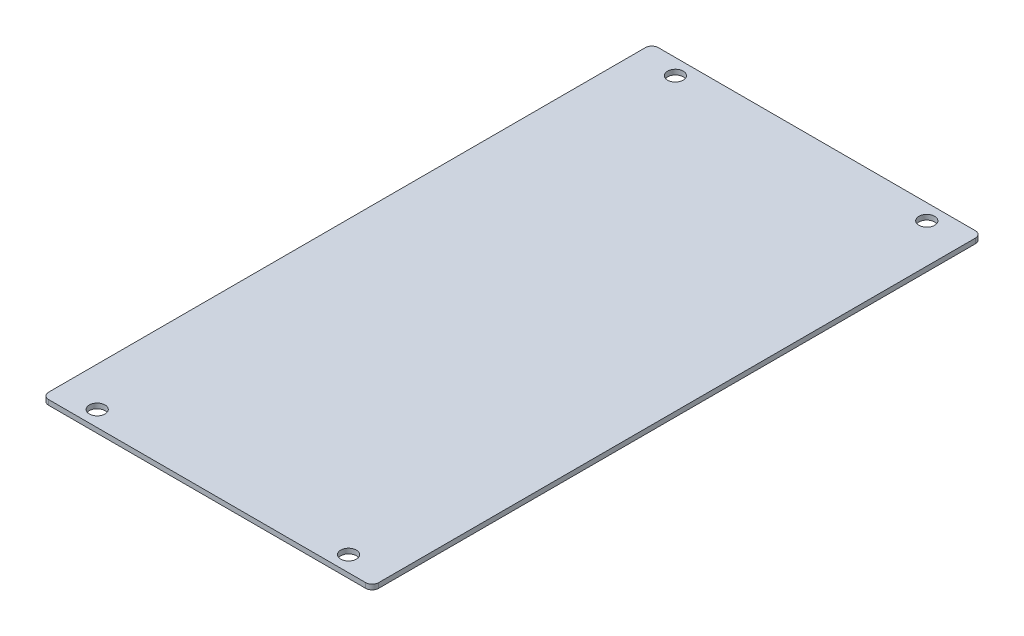
ISO-10303-21;
HEADER;
FILE_DESCRIPTION(('STEP AP214'),'2;1');
FILE_NAME('part.step','',(''),(''),'','','');
FILE_SCHEMA(('AUTOMOTIVE_DESIGN { 1 0 10303 214 1 1 1 1 }'));
ENDSEC;
DATA;
#1=APPLICATION_CONTEXT('core data for automotive mechanical design processes');
#2=APPLICATION_PROTOCOL_DEFINITION('international standard','automotive_design',2000,#1);
#3=PRODUCT_CONTEXT('',#1,'mechanical');
#4=PRODUCT('Part','Part','',(#3));
#5=PRODUCT_RELATED_PRODUCT_CATEGORY('part','',(#4));
#6=PRODUCT_DEFINITION_FORMATION('','',#4);
#7=PRODUCT_DEFINITION_CONTEXT('part definition',#1,'design');
#8=PRODUCT_DEFINITION('design','',#6,#7);
#9=PRODUCT_DEFINITION_SHAPE('','',#8);
#10=(LENGTH_UNIT() NAMED_UNIT(*) SI_UNIT(.MILLI.,.METRE.));
#11=(NAMED_UNIT(*) PLANE_ANGLE_UNIT() SI_UNIT($,.RADIAN.));
#12=(NAMED_UNIT(*) SI_UNIT($,.STERADIAN.) SOLID_ANGLE_UNIT());
#13=UNCERTAINTY_MEASURE_WITH_UNIT(LENGTH_MEASURE(1.E-05),#10,'distance_accuracy_value','');
#14=(GEOMETRIC_REPRESENTATION_CONTEXT(3) GLOBAL_UNCERTAINTY_ASSIGNED_CONTEXT((#13)) GLOBAL_UNIT_ASSIGNED_CONTEXT((#10,
#11,#12)) REPRESENTATION_CONTEXT('',''));
#15=CARTESIAN_POINT('',(0.,0.,0.));
#16=DIRECTION('',(0.,0.,1.));
#17=DIRECTION('',(1.,0.,0.));
#18=AXIS2_PLACEMENT_3D('',#15,#16,#17);
#19=CARTESIAN_POINT('',(0.,-3.175,0.));
#20=DIRECTION('',(-1.,0.,0.));
#21=DIRECTION('',(0.,0.,1.));
#22=AXIS2_PLACEMENT_3D('',#19,#20,#21);
#23=PLANE('',#22);
#24=DIRECTION('',(0.,0.,1.));
#25=VECTOR('',#24,1.);
#26=CARTESIAN_POINT('',(0.,-3.175,0.));
#27=LINE('',#26,#25);
#28=CARTESIAN_POINT('',(0.,-3.175,-383.9));
#29=VERTEX_POINT('',#28);
#30=CARTESIAN_POINT('',(0.,-3.175,-4.1));
#31=VERTEX_POINT('',#30);
#32=EDGE_CURVE('E172',#29,#31,#27,.T.);
#33=ORIENTED_EDGE('',*,*,#32,.T.);
#34=DIRECTION('',(0.,1.,0.));
#35=VECTOR('',#34,1.);
#36=CARTESIAN_POINT('',(0.,-3.175,-4.1));
#37=LINE('',#36,#35);
#38=CARTESIAN_POINT('',(0.,0.,-4.1));
#39=VERTEX_POINT('',#38);
#40=EDGE_CURVE('E126',#31,#39,#37,.T.);
#41=ORIENTED_EDGE('',*,*,#40,.T.);
#42=DIRECTION('',(0.,0.,1.));
#43=VECTOR('',#42,1.);
#44=CARTESIAN_POINT('',(0.,0.,0.));
#45=LINE('',#44,#43);
#46=CARTESIAN_POINT('',(0.,0.,-383.9));
#47=VERTEX_POINT('',#46);
#48=EDGE_CURVE('E110',#47,#39,#45,.T.);
#49=ORIENTED_EDGE('',*,*,#48,.F.);
#50=DIRECTION('',(0.,1.,0.));
#51=VECTOR('',#50,1.);
#52=CARTESIAN_POINT('',(0.,-3.175,-383.9));
#53=LINE('',#52,#51);
#54=EDGE_CURVE('E123',#47,#29,#53,.F.);
#55=ORIENTED_EDGE('',*,*,#54,.T.);
#56=EDGE_LOOP('',(#33,#41,#49,#55));
#57=FACE_BOUND('',#56,.T.);
#58=ADVANCED_FACE('F41',(#57),#23,.T.);
#59=CARTESIAN_POINT('',(0.,-3.175,-388.));
#60=DIRECTION('',(0.,0.,-1.));
#61=DIRECTION('',(-1.,0.,0.));
#62=AXIS2_PLACEMENT_3D('',#59,#60,#61);
#63=PLANE('',#62);
#64=DIRECTION('',(-1.,0.,0.));
#65=VECTOR('',#64,1.);
#66=CARTESIAN_POINT('',(0.,-3.175,-388.));
#67=LINE('',#66,#65);
#68=CARTESIAN_POINT('',(205.9,-3.175,-388.));
#69=VERTEX_POINT('',#68);
#70=CARTESIAN_POINT('',(4.1,-3.175,-388.));
#71=VERTEX_POINT('',#70);
#72=EDGE_CURVE('E133',#69,#71,#67,.T.);
#73=ORIENTED_EDGE('',*,*,#72,.T.);
#74=DIRECTION('',(0.,1.,0.));
#75=VECTOR('',#74,1.);
#76=CARTESIAN_POINT('',(4.1,-3.175,-388.));
#77=LINE('',#76,#75);
#78=CARTESIAN_POINT('',(4.1,0.,-388.));
#79=VERTEX_POINT('',#78);
#80=EDGE_CURVE('E159',#71,#79,#77,.T.);
#81=ORIENTED_EDGE('',*,*,#80,.T.);
#82=DIRECTION('',(-1.,0.,0.));
#83=VECTOR('',#82,1.);
#84=CARTESIAN_POINT('',(0.,0.,-388.));
#85=LINE('',#84,#83);
#86=CARTESIAN_POINT('',(205.9,0.,-388.));
#87=VERTEX_POINT('',#86);
#88=EDGE_CURVE('E112',#87,#79,#85,.T.);
#89=ORIENTED_EDGE('',*,*,#88,.F.);
#90=DIRECTION('',(0.,1.,0.));
#91=VECTOR('',#90,1.);
#92=CARTESIAN_POINT('',(205.9,-3.175,-388.));
#93=LINE('',#92,#91);
#94=EDGE_CURVE('E157',#87,#69,#93,.F.);
#95=ORIENTED_EDGE('',*,*,#94,.T.);
#96=EDGE_LOOP('',(#73,#81,#89,#95));
#97=FACE_BOUND('',#96,.T.);
#98=ADVANCED_FACE('F161',(#97),#63,.T.);
#99=CARTESIAN_POINT('',(210.,-3.175,0.));
#100=DIRECTION('',(1.,0.,0.));
#101=DIRECTION('',(0.,0.,-1.));
#102=AXIS2_PLACEMENT_3D('',#99,#100,#101);
#103=PLANE('',#102);
#104=DIRECTION('',(0.,0.,-1.));
#105=VECTOR('',#104,1.);
#106=CARTESIAN_POINT('',(210.,-3.175,0.));
#107=LINE('',#106,#105);
#108=CARTESIAN_POINT('',(210.,-3.175,-4.1));
#109=VERTEX_POINT('',#108);
#110=CARTESIAN_POINT('',(210.,-3.175,-383.9));
#111=VERTEX_POINT('',#110);
#112=EDGE_CURVE('E138',#109,#111,#107,.T.);
#113=ORIENTED_EDGE('',*,*,#112,.T.);
#114=DIRECTION('',(0.,1.,0.));
#115=VECTOR('',#114,1.);
#116=CARTESIAN_POINT('',(210.,-3.175,-383.9));
#117=LINE('',#116,#115);
#118=CARTESIAN_POINT('',(210.,0.,-383.9));
#119=VERTEX_POINT('',#118);
#120=EDGE_CURVE('E11',#111,#119,#117,.T.);
#121=ORIENTED_EDGE('',*,*,#120,.T.);
#122=DIRECTION('',(0.,0.,-1.));
#123=VECTOR('',#122,1.);
#124=CARTESIAN_POINT('',(210.,0.,0.));
#125=LINE('',#124,#123);
#126=CARTESIAN_POINT('',(210.,0.,-4.1));
#127=VERTEX_POINT('',#126);
#128=EDGE_CURVE('E170',#127,#119,#125,.T.);
#129=ORIENTED_EDGE('',*,*,#128,.F.);
#130=DIRECTION('',(0.,1.,0.));
#131=VECTOR('',#130,1.);
#132=CARTESIAN_POINT('',(210.,-3.175,-4.1));
#133=LINE('',#132,#131);
#134=EDGE_CURVE('E49',#127,#109,#133,.F.);
#135=ORIENTED_EDGE('',*,*,#134,.T.);
#136=EDGE_LOOP('',(#113,#121,#129,#135));
#137=FACE_BOUND('',#136,.T.);
#138=ADVANCED_FACE('F169',(#137),#103,.T.);
#139=CARTESIAN_POINT('',(0.,-3.175,0.));
#140=DIRECTION('',(0.,0.,1.));
#141=DIRECTION('',(1.,0.,0.));
#142=AXIS2_PLACEMENT_3D('',#139,#140,#141);
#143=PLANE('',#142);
#144=DIRECTION('',(1.,0.,0.));
#145=VECTOR('',#144,1.);
#146=CARTESIAN_POINT('',(0.,0.,0.));
#147=LINE('',#146,#145);
#148=CARTESIAN_POINT('',(4.1,0.,0.));
#149=VERTEX_POINT('',#148);
#150=CARTESIAN_POINT('',(205.9,0.,0.));
#151=VERTEX_POINT('',#150);
#152=EDGE_CURVE('E127',#149,#151,#147,.T.);
#153=ORIENTED_EDGE('',*,*,#152,.F.);
#154=DIRECTION('',(0.,1.,0.));
#155=VECTOR('',#154,1.);
#156=CARTESIAN_POINT('',(4.1,-3.175,0.));
#157=LINE('',#156,#155);
#158=CARTESIAN_POINT('',(4.1,-3.175,0.));
#159=VERTEX_POINT('',#158);
#160=EDGE_CURVE('E149',#149,#159,#157,.F.);
#161=ORIENTED_EDGE('',*,*,#160,.T.);
#162=DIRECTION('',(1.,0.,0.));
#163=VECTOR('',#162,1.);
#164=CARTESIAN_POINT('',(0.,-3.175,0.));
#165=LINE('',#164,#163);
#166=CARTESIAN_POINT('',(205.9,-3.175,0.));
#167=VERTEX_POINT('',#166);
#168=EDGE_CURVE('E176',#159,#167,#165,.T.);
#169=ORIENTED_EDGE('',*,*,#168,.T.);
#170=DIRECTION('',(0.,1.,0.));
#171=VECTOR('',#170,1.);
#172=CARTESIAN_POINT('',(205.9,-3.175,0.));
#173=LINE('',#172,#171);
#174=EDGE_CURVE('E146',#167,#151,#173,.T.);
#175=ORIENTED_EDGE('',*,*,#174,.T.);
#176=EDGE_LOOP('',(#153,#161,#169,#175));
#177=FACE_BOUND('',#176,.T.);
#178=ADVANCED_FACE('F235',(#177),#143,.T.);
#179=CARTESIAN_POINT('',(0.,-3.175,0.));
#180=DIRECTION('',(0.,-1.,0.));
#181=DIRECTION('',(0.,0.,-1.));
#182=AXIS2_PLACEMENT_3D('',#179,#180,#181);
#183=PLANE('',#182);
#184=CARTESIAN_POINT('',(25.,-3.175,-10.));
#185=DIRECTION('',(0.,-1.,0.));
#186=DIRECTION('',(0.,0.,-1.));
#187=AXIS2_PLACEMENT_3D('',#184,#185,#186);
#188=CIRCLE('',#187,5.);
#189=CARTESIAN_POINT('',(25.,-3.175,-15.));
#190=VERTEX_POINT('',#189);
#191=EDGE_CURVE('E128',#190,#190,#188,.T.);
#192=ORIENTED_EDGE('',*,*,#191,.F.);
#193=EDGE_LOOP('',(#192));
#194=FACE_BOUND('',#193,.T.);
#195=CARTESIAN_POINT('',(185.,-3.175,-10.));
#196=DIRECTION('',(0.,-1.,0.));
#197=DIRECTION('',(0.,0.,-1.));
#198=AXIS2_PLACEMENT_3D('',#195,#196,#197);
#199=CIRCLE('',#198,4.99999999999999);
#200=CARTESIAN_POINT('',(185.,-3.175,-15.));
#201=VERTEX_POINT('',#200);
#202=EDGE_CURVE('E182',#201,#201,#199,.T.);
#203=ORIENTED_EDGE('',*,*,#202,.F.);
#204=EDGE_LOOP('',(#203));
#205=FACE_BOUND('',#204,.T.);
#206=CARTESIAN_POINT('',(185.,-3.175,-378.));
#207=DIRECTION('',(0.,-1.,0.));
#208=DIRECTION('',(0.,0.,-1.));
#209=AXIS2_PLACEMENT_3D('',#206,#207,#208);
#210=CIRCLE('',#209,4.99999999999999);
#211=CARTESIAN_POINT('',(185.,-3.175,-383.));
#212=VERTEX_POINT('',#211);
#213=EDGE_CURVE('E185',#212,#212,#210,.T.);
#214=ORIENTED_EDGE('',*,*,#213,.F.);
#215=EDGE_LOOP('',(#214));
#216=FACE_BOUND('',#215,.T.);
#217=CARTESIAN_POINT('',(25.,-3.175,-378.));
#218=DIRECTION('',(0.,-1.,0.));
#219=DIRECTION('',(0.,0.,-1.));
#220=AXIS2_PLACEMENT_3D('',#217,#218,#219);
#221=CIRCLE('',#220,4.99999999999999);
#222=CARTESIAN_POINT('',(25.,-3.175,-383.));
#223=VERTEX_POINT('',#222);
#224=EDGE_CURVE('E188',#223,#223,#221,.T.);
#225=ORIENTED_EDGE('',*,*,#224,.F.);
#226=EDGE_LOOP('',(#225));
#227=FACE_BOUND('',#226,.T.);
#228=ORIENTED_EDGE('',*,*,#168,.F.);
#229=CARTESIAN_POINT('',(4.1,-3.175,-4.1));
#230=DIRECTION('',(0.,-1.,0.));
#231=DIRECTION('',(0.,0.,-1.));
#232=AXIS2_PLACEMENT_3D('',#229,#230,#231);
#233=CIRCLE('',#232,4.1);
#234=EDGE_CURVE('E155',#159,#31,#233,.T.);
#235=ORIENTED_EDGE('',*,*,#234,.T.);
#236=ORIENTED_EDGE('',*,*,#32,.F.);
#237=CARTESIAN_POINT('',(4.1,-3.175,-383.9));
#238=DIRECTION('',(0.,-1.,0.));
#239=DIRECTION('',(0.,0.,-1.));
#240=AXIS2_PLACEMENT_3D('',#237,#238,#239);
#241=CIRCLE('',#240,4.1);
#242=EDGE_CURVE('E132',#29,#71,#241,.T.);
#243=ORIENTED_EDGE('',*,*,#242,.T.);
#244=ORIENTED_EDGE('',*,*,#72,.F.);
#245=CARTESIAN_POINT('',(205.9,-3.175,-383.9));
#246=DIRECTION('',(0.,-1.,0.));
#247=DIRECTION('',(0.,0.,-1.));
#248=AXIS2_PLACEMENT_3D('',#245,#246,#247);
#249=CIRCLE('',#248,4.1);
#250=EDGE_CURVE('E56',#69,#111,#249,.T.);
#251=ORIENTED_EDGE('',*,*,#250,.T.);
#252=ORIENTED_EDGE('',*,*,#112,.F.);
#253=CARTESIAN_POINT('',(205.9,-3.175,-4.1));
#254=DIRECTION('',(0.,-1.,0.));
#255=DIRECTION('',(0.,0.,-1.));
#256=AXIS2_PLACEMENT_3D('',#253,#254,#255);
#257=CIRCLE('',#256,4.1);
#258=EDGE_CURVE('E151',#109,#167,#257,.T.);
#259=ORIENTED_EDGE('',*,*,#258,.T.);
#260=EDGE_LOOP('',(#228,#235,#236,#243,#244,#251,#252,#259));
#261=FACE_BOUND('',#260,.T.);
#262=ADVANCED_FACE('F164',(#194,#205,#216,#227,#261),#183,.T.);
#263=CARTESIAN_POINT('',(0.,0.,0.));
#264=DIRECTION('',(0.,-1.,0.));
#265=DIRECTION('',(0.,0.,-1.));
#266=AXIS2_PLACEMENT_3D('',#263,#264,#265);
#267=PLANE('',#266);
#268=CARTESIAN_POINT('',(25.,0.,-10.));
#269=DIRECTION('',(0.,1.,0.));
#270=DIRECTION('',(0.,0.,1.));
#271=AXIS2_PLACEMENT_3D('',#268,#269,#270);
#272=CIRCLE('',#271,5.);
#273=CARTESIAN_POINT('',(25.,0.,-5.));
#274=VERTEX_POINT('',#273);
#275=EDGE_CURVE('E195',#274,#274,#272,.T.);
#276=ORIENTED_EDGE('',*,*,#275,.F.);
#277=EDGE_LOOP('',(#276));
#278=FACE_BOUND('',#277,.T.);
#279=CARTESIAN_POINT('',(185.,0.,-10.));
#280=DIRECTION('',(0.,1.,0.));
#281=DIRECTION('',(0.,0.,1.));
#282=AXIS2_PLACEMENT_3D('',#279,#280,#281);
#283=CIRCLE('',#282,4.99999999999999);
#284=CARTESIAN_POINT('',(185.,0.,-5.00000000000001));
#285=VERTEX_POINT('',#284);
#286=EDGE_CURVE('E198',#285,#285,#283,.T.);
#287=ORIENTED_EDGE('',*,*,#286,.F.);
#288=EDGE_LOOP('',(#287));
#289=FACE_BOUND('',#288,.T.);
#290=CARTESIAN_POINT('',(185.,0.,-378.));
#291=DIRECTION('',(0.,1.,0.));
#292=DIRECTION('',(0.,0.,1.));
#293=AXIS2_PLACEMENT_3D('',#290,#291,#292);
#294=CIRCLE('',#293,4.99999999999999);
#295=CARTESIAN_POINT('',(185.,0.,-373.));
#296=VERTEX_POINT('',#295);
#297=EDGE_CURVE('E194',#296,#296,#294,.T.);
#298=ORIENTED_EDGE('',*,*,#297,.F.);
#299=EDGE_LOOP('',(#298));
#300=FACE_BOUND('',#299,.T.);
#301=CARTESIAN_POINT('',(25.,0.,-378.));
#302=DIRECTION('',(0.,1.,0.));
#303=DIRECTION('',(0.,0.,1.));
#304=AXIS2_PLACEMENT_3D('',#301,#302,#303);
#305=CIRCLE('',#304,4.99999999999999);
#306=CARTESIAN_POINT('',(25.,0.,-373.));
#307=VERTEX_POINT('',#306);
#308=EDGE_CURVE('E191',#307,#307,#305,.T.);
#309=ORIENTED_EDGE('',*,*,#308,.F.);
#310=EDGE_LOOP('',(#309));
#311=FACE_BOUND('',#310,.T.);
#312=ORIENTED_EDGE('',*,*,#48,.T.);
#313=CARTESIAN_POINT('',(4.1,0.,-4.1));
#314=DIRECTION('',(0.,-1.,0.));
#315=DIRECTION('',(0.,0.,-1.));
#316=AXIS2_PLACEMENT_3D('',#313,#314,#315);
#317=CIRCLE('',#316,4.1);
#318=EDGE_CURVE('E117',#39,#149,#317,.F.);
#319=ORIENTED_EDGE('',*,*,#318,.T.);
#320=ORIENTED_EDGE('',*,*,#152,.T.);
#321=CARTESIAN_POINT('',(205.9,0.,-4.1));
#322=DIRECTION('',(0.,-1.,0.));
#323=DIRECTION('',(0.,0.,-1.));
#324=AXIS2_PLACEMENT_3D('',#321,#322,#323);
#325=CIRCLE('',#324,4.1);
#326=EDGE_CURVE('E135',#151,#127,#325,.F.);
#327=ORIENTED_EDGE('',*,*,#326,.T.);
#328=ORIENTED_EDGE('',*,*,#128,.T.);
#329=CARTESIAN_POINT('',(205.9,0.,-383.9));
#330=DIRECTION('',(0.,-1.,0.));
#331=DIRECTION('',(0.,0.,-1.));
#332=AXIS2_PLACEMENT_3D('',#329,#330,#331);
#333=CIRCLE('',#332,4.1);
#334=EDGE_CURVE('E118',#119,#87,#333,.F.);
#335=ORIENTED_EDGE('',*,*,#334,.T.);
#336=ORIENTED_EDGE('',*,*,#88,.T.);
#337=CARTESIAN_POINT('',(4.1,0.,-383.9));
#338=DIRECTION('',(0.,-1.,0.));
#339=DIRECTION('',(0.,0.,-1.));
#340=AXIS2_PLACEMENT_3D('',#337,#338,#339);
#341=CIRCLE('',#340,4.1);
#342=EDGE_CURVE('E107',#79,#47,#341,.F.);
#343=ORIENTED_EDGE('',*,*,#342,.T.);
#344=EDGE_LOOP('',(#312,#319,#320,#327,#328,#335,#336,#343));
#345=FACE_BOUND('',#344,.T.);
#346=ADVANCED_FACE('F109',(#278,#289,#300,#311,#345),#267,.F.);
#347=CARTESIAN_POINT('',(4.1,-3.175,-4.1));
#348=DIRECTION('',(0.,1.,0.));
#349=DIRECTION('',(0.,0.,1.));
#350=AXIS2_PLACEMENT_3D('',#347,#348,#349);
#351=CYLINDRICAL_SURFACE('',#350,4.1);
#352=ORIENTED_EDGE('',*,*,#234,.F.);
#353=ORIENTED_EDGE('',*,*,#160,.F.);
#354=ORIENTED_EDGE('',*,*,#318,.F.);
#355=ORIENTED_EDGE('',*,*,#40,.F.);
#356=EDGE_LOOP('',(#352,#353,#354,#355));
#357=FACE_BOUND('',#356,.T.);
#358=ADVANCED_FACE('F208',(#357),#351,.T.);
#359=CARTESIAN_POINT('',(4.1,-3.175,-383.9));
#360=DIRECTION('',(0.,1.,0.));
#361=DIRECTION('',(0.,0.,1.));
#362=AXIS2_PLACEMENT_3D('',#359,#360,#361);
#363=CYLINDRICAL_SURFACE('',#362,4.1);
#364=ORIENTED_EDGE('',*,*,#242,.F.);
#365=ORIENTED_EDGE('',*,*,#54,.F.);
#366=ORIENTED_EDGE('',*,*,#342,.F.);
#367=ORIENTED_EDGE('',*,*,#80,.F.);
#368=EDGE_LOOP('',(#364,#365,#366,#367));
#369=FACE_BOUND('',#368,.T.);
#370=ADVANCED_FACE('F131',(#369),#363,.T.);
#371=CARTESIAN_POINT('',(205.9,-3.175,-383.9));
#372=DIRECTION('',(0.,1.,0.));
#373=DIRECTION('',(0.,0.,1.));
#374=AXIS2_PLACEMENT_3D('',#371,#372,#373);
#375=CYLINDRICAL_SURFACE('',#374,4.1);
#376=ORIENTED_EDGE('',*,*,#250,.F.);
#377=ORIENTED_EDGE('',*,*,#94,.F.);
#378=ORIENTED_EDGE('',*,*,#334,.F.);
#379=ORIENTED_EDGE('',*,*,#120,.F.);
#380=EDGE_LOOP('',(#376,#377,#378,#379));
#381=FACE_BOUND('',#380,.T.);
#382=ADVANCED_FACE('F167',(#381),#375,.T.);
#383=CARTESIAN_POINT('',(205.9,-3.175,-4.1));
#384=DIRECTION('',(0.,1.,0.));
#385=DIRECTION('',(0.,0.,1.));
#386=AXIS2_PLACEMENT_3D('',#383,#384,#385);
#387=CYLINDRICAL_SURFACE('',#386,4.1);
#388=ORIENTED_EDGE('',*,*,#258,.F.);
#389=ORIENTED_EDGE('',*,*,#134,.F.);
#390=ORIENTED_EDGE('',*,*,#326,.F.);
#391=ORIENTED_EDGE('',*,*,#174,.F.);
#392=EDGE_LOOP('',(#388,#389,#390,#391));
#393=FACE_BOUND('',#392,.T.);
#394=ADVANCED_FACE('F43',(#393),#387,.T.);
#395=CARTESIAN_POINT('',(25.,-10.,-378.));
#396=DIRECTION('',(0.,1.,0.));
#397=DIRECTION('',(0.,0.,1.));
#398=AXIS2_PLACEMENT_3D('',#395,#396,#397);
#399=CYLINDRICAL_SURFACE('',#398,4.99999999999999);
#400=ORIENTED_EDGE('',*,*,#224,.T.);
#401=EDGE_LOOP('',(#400));
#402=FACE_BOUND('',#401,.T.);
#403=ORIENTED_EDGE('',*,*,#308,.T.);
#404=EDGE_LOOP('',(#403));
#405=FACE_BOUND('',#404,.T.);
#406=ADVANCED_FACE('F213',(#402,#405),#399,.F.);
#407=CARTESIAN_POINT('',(185.,-10.,-378.));
#408=DIRECTION('',(0.,1.,0.));
#409=DIRECTION('',(0.,0.,1.));
#410=AXIS2_PLACEMENT_3D('',#407,#408,#409);
#411=CYLINDRICAL_SURFACE('',#410,4.99999999999999);
#412=ORIENTED_EDGE('',*,*,#213,.T.);
#413=EDGE_LOOP('',(#412));
#414=FACE_BOUND('',#413,.T.);
#415=ORIENTED_EDGE('',*,*,#297,.T.);
#416=EDGE_LOOP('',(#415));
#417=FACE_BOUND('',#416,.T.);
#418=ADVANCED_FACE('F204',(#414,#417),#411,.F.);
#419=CARTESIAN_POINT('',(185.,-10.,-10.));
#420=DIRECTION('',(0.,1.,0.));
#421=DIRECTION('',(0.,0.,1.));
#422=AXIS2_PLACEMENT_3D('',#419,#420,#421);
#423=CYLINDRICAL_SURFACE('',#422,4.99999999999999);
#424=ORIENTED_EDGE('',*,*,#202,.T.);
#425=EDGE_LOOP('',(#424));
#426=FACE_BOUND('',#425,.T.);
#427=ORIENTED_EDGE('',*,*,#286,.T.);
#428=EDGE_LOOP('',(#427));
#429=FACE_BOUND('',#428,.T.);
#430=ADVANCED_FACE('F220',(#426,#429),#423,.F.);
#431=CARTESIAN_POINT('',(25.,-10.,-10.));
#432=DIRECTION('',(0.,1.,0.));
#433=DIRECTION('',(0.,0.,1.));
#434=AXIS2_PLACEMENT_3D('',#431,#432,#433);
#435=CYLINDRICAL_SURFACE('',#434,5.);
#436=ORIENTED_EDGE('',*,*,#191,.T.);
#437=EDGE_LOOP('',(#436));
#438=FACE_BOUND('',#437,.T.);
#439=ORIENTED_EDGE('',*,*,#275,.T.);
#440=EDGE_LOOP('',(#439));
#441=FACE_BOUND('',#440,.T.);
#442=ADVANCED_FACE('F301',(#438,#441),#435,.F.);
#443=CLOSED_SHELL('',(#58,#98,#138,#178,#262,#346,#358,#370,#382,#394,#406,#418,#430,#442));
#444=MANIFOLD_SOLID_BREP('B2',#443);
#445=ADVANCED_BREP_SHAPE_REPRESENTATION('',(#18,#444),#14);
#446=SHAPE_DEFINITION_REPRESENTATION(#9,#445);
ENDSEC;
END-ISO-10303-21;
